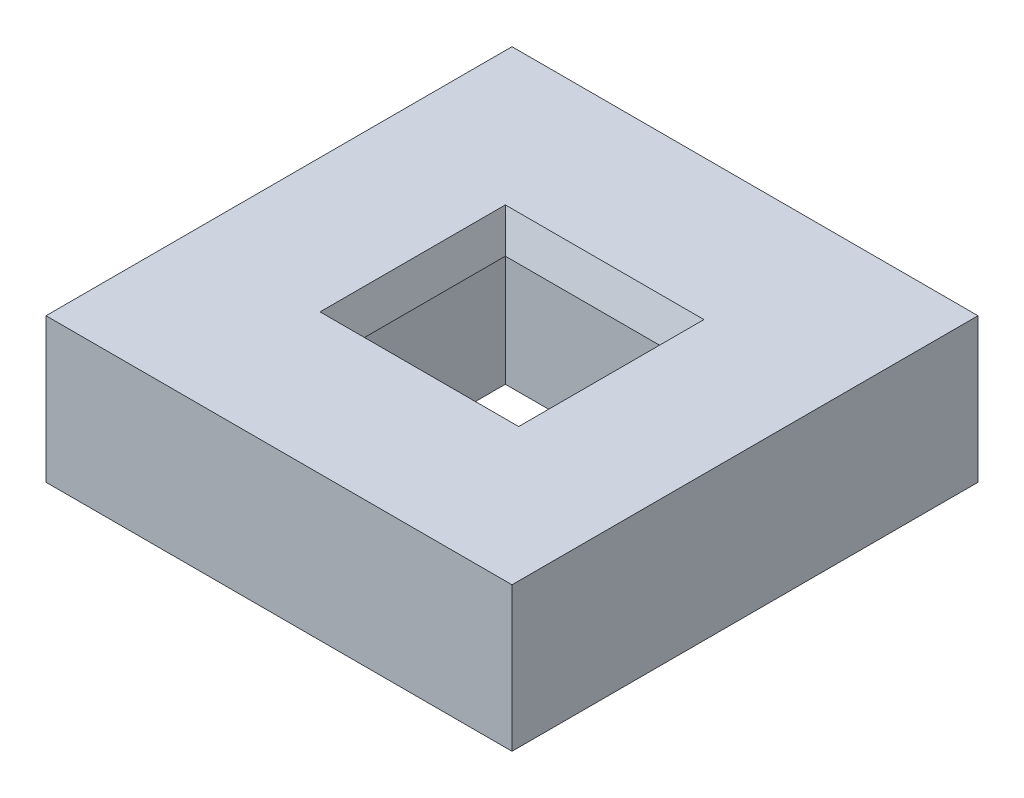
ISO-10303-21;
HEADER;
FILE_DESCRIPTION(('STEP AP214'),'2;1');
FILE_NAME('part.step','',(''),(''),'','','');
FILE_SCHEMA(('AUTOMOTIVE_DESIGN { 1 0 10303 214 1 1 1 1 }'));
ENDSEC;
DATA;
#1=APPLICATION_CONTEXT('core data for automotive mechanical design processes');
#2=APPLICATION_PROTOCOL_DEFINITION('international standard','automotive_design',2000,#1);
#3=PRODUCT_CONTEXT('',#1,'mechanical');
#4=PRODUCT('Part','Part','',(#3));
#5=PRODUCT_RELATED_PRODUCT_CATEGORY('part','',(#4));
#6=PRODUCT_DEFINITION_FORMATION('','',#4);
#7=PRODUCT_DEFINITION_CONTEXT('part definition',#1,'design');
#8=PRODUCT_DEFINITION('design','',#6,#7);
#9=PRODUCT_DEFINITION_SHAPE('','',#8);
#10=(LENGTH_UNIT() NAMED_UNIT(*) SI_UNIT(.MILLI.,.METRE.));
#11=(NAMED_UNIT(*) PLANE_ANGLE_UNIT() SI_UNIT($,.RADIAN.));
#12=(NAMED_UNIT(*) SI_UNIT($,.STERADIAN.) SOLID_ANGLE_UNIT());
#13=UNCERTAINTY_MEASURE_WITH_UNIT(LENGTH_MEASURE(1.E-05),#10,'distance_accuracy_value','');
#14=(GEOMETRIC_REPRESENTATION_CONTEXT(3) GLOBAL_UNCERTAINTY_ASSIGNED_CONTEXT((#13)) GLOBAL_UNIT_ASSIGNED_CONTEXT((#10,
#11,#12)) REPRESENTATION_CONTEXT('',''));
#15=CARTESIAN_POINT('',(0.,0.,0.));
#16=DIRECTION('',(0.,0.,1.));
#17=DIRECTION('',(1.,0.,0.));
#18=AXIS2_PLACEMENT_3D('',#15,#16,#17);
#19=CARTESIAN_POINT('',(0.,6.5,0.));
#20=DIRECTION('',(0.,1.,0.));
#21=DIRECTION('',(0.,0.,1.));
#22=AXIS2_PLACEMENT_3D('',#19,#20,#21);
#23=PLANE('',#22);
#24=DIRECTION('',(1.,0.,0.));
#25=VECTOR('',#24,1.);
#26=CARTESIAN_POINT('',(0.,6.5,-4.175));
#27=LINE('',#26,#25);
#28=CARTESIAN_POINT('',(-4.475,6.5,-4.175));
#29=VERTEX_POINT('',#28);
#30=CARTESIAN_POINT('',(4.475,6.5,-4.175));
#31=VERTEX_POINT('',#30);
#32=EDGE_CURVE('E177',#29,#31,#27,.T.);
#33=ORIENTED_EDGE('',*,*,#32,.T.);
#34=DIRECTION('',(0.,0.,1.));
#35=VECTOR('',#34,1.);
#36=CARTESIAN_POINT('',(4.475,6.5,0.));
#37=LINE('',#36,#35);
#38=CARTESIAN_POINT('',(4.475,6.5,4.175));
#39=VERTEX_POINT('',#38);
#40=EDGE_CURVE('E183',#31,#39,#37,.T.);
#41=ORIENTED_EDGE('',*,*,#40,.T.);
#42=DIRECTION('',(-1.,0.,0.));
#43=VECTOR('',#42,1.);
#44=CARTESIAN_POINT('',(0.,6.5,4.175));
#45=LINE('',#44,#43);
#46=CARTESIAN_POINT('',(-4.475,6.5,4.175));
#47=VERTEX_POINT('',#46);
#48=EDGE_CURVE('E181',#39,#47,#45,.T.);
#49=ORIENTED_EDGE('',*,*,#48,.T.);
#50=DIRECTION('',(0.,0.,-1.));
#51=VECTOR('',#50,1.);
#52=CARTESIAN_POINT('',(-4.475,6.5,0.));
#53=LINE('',#52,#51);
#54=EDGE_CURVE('E179',#47,#29,#53,.T.);
#55=ORIENTED_EDGE('',*,*,#54,.T.);
#56=EDGE_LOOP('',(#33,#41,#49,#55));
#57=FACE_BOUND('',#56,.T.);
#58=DIRECTION('',(0.,0.,1.));
#59=VECTOR('',#58,1.);
#60=CARTESIAN_POINT('',(-10.5,6.5,-10.5));
#61=LINE('',#60,#59);
#62=CARTESIAN_POINT('',(-10.5,6.5,-10.5));
#63=VERTEX_POINT('',#62);
#64=CARTESIAN_POINT('',(-10.5,6.5,10.5));
#65=VERTEX_POINT('',#64);
#66=EDGE_CURVE('E145',#63,#65,#61,.T.);
#67=ORIENTED_EDGE('',*,*,#66,.T.);
#68=DIRECTION('',(1.,0.,0.));
#69=VECTOR('',#68,1.);
#70=CARTESIAN_POINT('',(-10.5,6.5,10.5));
#71=LINE('',#70,#69);
#72=CARTESIAN_POINT('',(10.5,6.5,10.5));
#73=VERTEX_POINT('',#72);
#74=EDGE_CURVE('E148',#65,#73,#71,.T.);
#75=ORIENTED_EDGE('',*,*,#74,.T.);
#76=DIRECTION('',(0.,0.,-1.));
#77=VECTOR('',#76,1.);
#78=CARTESIAN_POINT('',(10.5,6.5,-10.5));
#79=LINE('',#78,#77);
#80=CARTESIAN_POINT('',(10.5,6.5,-10.5));
#81=VERTEX_POINT('',#80);
#82=EDGE_CURVE('E151',#73,#81,#79,.T.);
#83=ORIENTED_EDGE('',*,*,#82,.T.);
#84=DIRECTION('',(-1.,0.,0.));
#85=VECTOR('',#84,1.);
#86=CARTESIAN_POINT('',(-10.5,6.5,-10.5));
#87=LINE('',#86,#85);
#88=EDGE_CURVE('E153',#81,#63,#87,.T.);
#89=ORIENTED_EDGE('',*,*,#88,.T.);
#90=EDGE_LOOP('',(#67,#75,#83,#89));
#91=FACE_BOUND('',#90,.T.);
#92=ADVANCED_FACE('F35',(#57,#91),#23,.T.);
#93=CARTESIAN_POINT('',(0.,0.,0.));
#94=DIRECTION('',(0.,1.,0.));
#95=DIRECTION('',(0.,0.,1.));
#96=AXIS2_PLACEMENT_3D('',#93,#94,#95);
#97=PLANE('',#96);
#98=DIRECTION('',(0.,0.,1.));
#99=VECTOR('',#98,1.);
#100=CARTESIAN_POINT('',(-10.5,0.,-10.5));
#101=LINE('',#100,#99);
#102=CARTESIAN_POINT('',(-10.5,0.,-10.5));
#103=VERTEX_POINT('',#102);
#104=CARTESIAN_POINT('',(-10.5,0.,10.5));
#105=VERTEX_POINT('',#104);
#106=EDGE_CURVE('E119',#103,#105,#101,.T.);
#107=ORIENTED_EDGE('',*,*,#106,.F.);
#108=DIRECTION('',(-1.,0.,0.));
#109=VECTOR('',#108,1.);
#110=CARTESIAN_POINT('',(-10.5,0.,-10.5));
#111=LINE('',#110,#109);
#112=CARTESIAN_POINT('',(10.5,0.,-10.5));
#113=VERTEX_POINT('',#112);
#114=EDGE_CURVE('E149',#113,#103,#111,.T.);
#115=ORIENTED_EDGE('',*,*,#114,.F.);
#116=DIRECTION('',(0.,0.,-1.));
#117=VECTOR('',#116,1.);
#118=CARTESIAN_POINT('',(10.5,0.,-10.5));
#119=LINE('',#118,#117);
#120=CARTESIAN_POINT('',(10.5,0.,10.5));
#121=VERTEX_POINT('',#120);
#122=EDGE_CURVE('E160',#121,#113,#119,.T.);
#123=ORIENTED_EDGE('',*,*,#122,.F.);
#124=DIRECTION('',(1.,0.,0.));
#125=VECTOR('',#124,1.);
#126=CARTESIAN_POINT('',(-10.5,0.,10.5));
#127=LINE('',#126,#125);
#128=EDGE_CURVE('E158',#105,#121,#127,.T.);
#129=ORIENTED_EDGE('',*,*,#128,.F.);
#130=EDGE_LOOP('',(#107,#115,#123,#129));
#131=FACE_BOUND('',#130,.T.);
#132=DIRECTION('',(0.,0.,1.));
#133=VECTOR('',#132,1.);
#134=CARTESIAN_POINT('',(-3.975,0.,-3.675));
#135=LINE('',#134,#133);
#136=CARTESIAN_POINT('',(-3.975,0.,-3.675));
#137=VERTEX_POINT('',#136);
#138=CARTESIAN_POINT('',(-3.975,0.,3.675));
#139=VERTEX_POINT('',#138);
#140=EDGE_CURVE('E115',#137,#139,#135,.T.);
#141=ORIENTED_EDGE('',*,*,#140,.T.);
#142=DIRECTION('',(1.,0.,0.));
#143=VECTOR('',#142,1.);
#144=CARTESIAN_POINT('',(-3.975,0.,3.675));
#145=LINE('',#144,#143);
#146=CARTESIAN_POINT('',(3.975,0.,3.675));
#147=VERTEX_POINT('',#146);
#148=EDGE_CURVE('E123',#139,#147,#145,.T.);
#149=ORIENTED_EDGE('',*,*,#148,.T.);
#150=DIRECTION('',(0.,0.,-1.));
#151=VECTOR('',#150,1.);
#152=CARTESIAN_POINT('',(3.975,0.,-3.675));
#153=LINE('',#152,#151);
#154=CARTESIAN_POINT('',(3.975,0.,-3.675));
#155=VERTEX_POINT('',#154);
#156=EDGE_CURVE('E129',#147,#155,#153,.T.);
#157=ORIENTED_EDGE('',*,*,#156,.T.);
#158=DIRECTION('',(-1.,0.,0.));
#159=VECTOR('',#158,1.);
#160=CARTESIAN_POINT('',(-3.975,0.,-3.675));
#161=LINE('',#160,#159);
#162=EDGE_CURVE('E133',#155,#137,#161,.T.);
#163=ORIENTED_EDGE('',*,*,#162,.T.);
#164=EDGE_LOOP('',(#141,#149,#157,#163));
#165=FACE_BOUND('',#164,.T.);
#166=ADVANCED_FACE('F131',(#131,#165),#97,.F.);
#167=CARTESIAN_POINT('',(-10.5,6.5,-10.5));
#168=DIRECTION('',(1.,0.,0.));
#169=DIRECTION('',(0.,0.,-1.));
#170=AXIS2_PLACEMENT_3D('',#167,#168,#169);
#171=PLANE('',#170);
#172=ORIENTED_EDGE('',*,*,#106,.T.);
#173=DIRECTION('',(0.,-1.,0.));
#174=VECTOR('',#173,1.);
#175=CARTESIAN_POINT('',(-10.5,6.5,10.5));
#176=LINE('',#175,#174);
#177=EDGE_CURVE('E171',#65,#105,#176,.T.);
#178=ORIENTED_EDGE('',*,*,#177,.F.);
#179=ORIENTED_EDGE('',*,*,#66,.F.);
#180=DIRECTION('',(0.,-1.,0.));
#181=VECTOR('',#180,1.);
#182=CARTESIAN_POINT('',(-10.5,6.5,-10.5));
#183=LINE('',#182,#181);
#184=EDGE_CURVE('E155',#63,#103,#183,.T.);
#185=ORIENTED_EDGE('',*,*,#184,.T.);
#186=EDGE_LOOP('',(#172,#178,#179,#185));
#187=FACE_BOUND('',#186,.T.);
#188=ADVANCED_FACE('F222',(#187),#171,.F.);
#189=CARTESIAN_POINT('',(-10.5,6.5,10.5));
#190=DIRECTION('',(0.,0.,-1.));
#191=DIRECTION('',(-1.,0.,0.));
#192=AXIS2_PLACEMENT_3D('',#189,#190,#191);
#193=PLANE('',#192);
#194=ORIENTED_EDGE('',*,*,#128,.T.);
#195=DIRECTION('',(0.,-1.,0.));
#196=VECTOR('',#195,1.);
#197=CARTESIAN_POINT('',(10.5,6.5,10.5));
#198=LINE('',#197,#196);
#199=EDGE_CURVE('E168',#73,#121,#198,.T.);
#200=ORIENTED_EDGE('',*,*,#199,.F.);
#201=ORIENTED_EDGE('',*,*,#74,.F.);
#202=ORIENTED_EDGE('',*,*,#177,.T.);
#203=EDGE_LOOP('',(#194,#200,#201,#202));
#204=FACE_BOUND('',#203,.T.);
#205=ADVANCED_FACE('F236',(#204),#193,.F.);
#206=CARTESIAN_POINT('',(10.5,6.5,-10.5));
#207=DIRECTION('',(-1.,0.,0.));
#208=DIRECTION('',(0.,0.,1.));
#209=AXIS2_PLACEMENT_3D('',#206,#207,#208);
#210=PLANE('',#209);
#211=ORIENTED_EDGE('',*,*,#122,.T.);
#212=DIRECTION('',(0.,-1.,0.));
#213=VECTOR('',#212,1.);
#214=CARTESIAN_POINT('',(10.5,6.5,-10.5));
#215=LINE('',#214,#213);
#216=EDGE_CURVE('E165',#81,#113,#215,.T.);
#217=ORIENTED_EDGE('',*,*,#216,.F.);
#218=ORIENTED_EDGE('',*,*,#82,.F.);
#219=ORIENTED_EDGE('',*,*,#199,.T.);
#220=EDGE_LOOP('',(#211,#217,#218,#219));
#221=FACE_BOUND('',#220,.T.);
#222=ADVANCED_FACE('F232',(#221),#210,.F.);
#223=CARTESIAN_POINT('',(-10.5,6.5,-10.5));
#224=DIRECTION('',(0.,0.,1.));
#225=DIRECTION('',(1.,0.,0.));
#226=AXIS2_PLACEMENT_3D('',#223,#224,#225);
#227=PLANE('',#226);
#228=ORIENTED_EDGE('',*,*,#114,.T.);
#229=ORIENTED_EDGE('',*,*,#184,.F.);
#230=ORIENTED_EDGE('',*,*,#88,.F.);
#231=ORIENTED_EDGE('',*,*,#216,.T.);
#232=EDGE_LOOP('',(#228,#229,#230,#231));
#233=FACE_BOUND('',#232,.T.);
#234=ADVANCED_FACE('F229',(#233),#227,.F.);
#235=CARTESIAN_POINT('',(-3.975,6.5,-3.675));
#236=DIRECTION('',(1.,0.,0.));
#237=DIRECTION('',(0.,0.,-1.));
#238=AXIS2_PLACEMENT_3D('',#235,#236,#237);
#239=PLANE('',#238);
#240=DIRECTION('',(0.,-1.,0.));
#241=VECTOR('',#240,1.);
#242=CARTESIAN_POINT('',(-3.975,6.5,-3.675));
#243=LINE('',#242,#241);
#244=CARTESIAN_POINT('',(-3.975,4.99999999999998,-3.675));
#245=VERTEX_POINT('',#244);
#246=EDGE_CURVE('E140',#245,#137,#243,.T.);
#247=ORIENTED_EDGE('',*,*,#246,.F.);
#248=DIRECTION('',(0.,0.,1.));
#249=VECTOR('',#248,1.);
#250=CARTESIAN_POINT('',(-3.975,4.99999999999998,-3.675));
#251=LINE('',#250,#249);
#252=CARTESIAN_POINT('',(-3.975,4.99999999999998,3.675));
#253=VERTEX_POINT('',#252);
#254=EDGE_CURVE('E45',#245,#253,#251,.T.);
#255=ORIENTED_EDGE('',*,*,#254,.T.);
#256=DIRECTION('',(0.,-1.,0.));
#257=VECTOR('',#256,1.);
#258=CARTESIAN_POINT('',(-3.975,6.5,3.675));
#259=LINE('',#258,#257);
#260=EDGE_CURVE('E111',#253,#139,#259,.T.);
#261=ORIENTED_EDGE('',*,*,#260,.T.);
#262=ORIENTED_EDGE('',*,*,#140,.F.);
#263=EDGE_LOOP('',(#247,#255,#261,#262));
#264=FACE_BOUND('',#263,.T.);
#265=ADVANCED_FACE('F113',(#264),#239,.T.);
#266=CARTESIAN_POINT('',(-3.975,6.5,3.675));
#267=DIRECTION('',(0.,0.,-1.));
#268=DIRECTION('',(-1.,0.,0.));
#269=AXIS2_PLACEMENT_3D('',#266,#267,#268);
#270=PLANE('',#269);
#271=ORIENTED_EDGE('',*,*,#260,.F.);
#272=DIRECTION('',(1.,0.,0.));
#273=VECTOR('',#272,1.);
#274=CARTESIAN_POINT('',(-3.975,4.99999999999998,3.675));
#275=LINE('',#274,#273);
#276=CARTESIAN_POINT('',(3.975,4.99999999999998,3.675));
#277=VERTEX_POINT('',#276);
#278=EDGE_CURVE('E186',#253,#277,#275,.T.);
#279=ORIENTED_EDGE('',*,*,#278,.T.);
#280=DIRECTION('',(0.,-1.,0.));
#281=VECTOR('',#280,1.);
#282=CARTESIAN_POINT('',(3.975,6.5,3.675));
#283=LINE('',#282,#281);
#284=EDGE_CURVE('E120',#277,#147,#283,.T.);
#285=ORIENTED_EDGE('',*,*,#284,.T.);
#286=ORIENTED_EDGE('',*,*,#148,.F.);
#287=EDGE_LOOP('',(#271,#279,#285,#286));
#288=FACE_BOUND('',#287,.T.);
#289=ADVANCED_FACE('F124',(#288),#270,.T.);
#290=CARTESIAN_POINT('',(3.975,6.5,-3.675));
#291=DIRECTION('',(-1.,0.,0.));
#292=DIRECTION('',(0.,0.,1.));
#293=AXIS2_PLACEMENT_3D('',#290,#291,#292);
#294=PLANE('',#293);
#295=ORIENTED_EDGE('',*,*,#284,.F.);
#296=DIRECTION('',(0.,0.,-1.));
#297=VECTOR('',#296,1.);
#298=CARTESIAN_POINT('',(3.975,4.99999999999998,-3.675));
#299=LINE('',#298,#297);
#300=CARTESIAN_POINT('',(3.975,4.99999999999998,-3.675));
#301=VERTEX_POINT('',#300);
#302=EDGE_CURVE('E174',#277,#301,#299,.T.);
#303=ORIENTED_EDGE('',*,*,#302,.T.);
#304=DIRECTION('',(0.,-1.,0.));
#305=VECTOR('',#304,1.);
#306=CARTESIAN_POINT('',(3.975,6.5,-3.675));
#307=LINE('',#306,#305);
#308=EDGE_CURVE('E142',#301,#155,#307,.T.);
#309=ORIENTED_EDGE('',*,*,#308,.T.);
#310=ORIENTED_EDGE('',*,*,#156,.F.);
#311=EDGE_LOOP('',(#295,#303,#309,#310));
#312=FACE_BOUND('',#311,.T.);
#313=ADVANCED_FACE('F207',(#312),#294,.T.);
#314=CARTESIAN_POINT('',(-3.975,6.5,-3.675));
#315=DIRECTION('',(0.,0.,1.));
#316=DIRECTION('',(1.,0.,0.));
#317=AXIS2_PLACEMENT_3D('',#314,#315,#316);
#318=PLANE('',#317);
#319=ORIENTED_EDGE('',*,*,#308,.F.);
#320=DIRECTION('',(-1.,0.,0.));
#321=VECTOR('',#320,1.);
#322=CARTESIAN_POINT('',(-3.975,4.99999999999998,-3.675));
#323=LINE('',#322,#321);
#324=EDGE_CURVE('E11',#301,#245,#323,.T.);
#325=ORIENTED_EDGE('',*,*,#324,.T.);
#326=ORIENTED_EDGE('',*,*,#246,.T.);
#327=ORIENTED_EDGE('',*,*,#162,.F.);
#328=EDGE_LOOP('',(#319,#325,#326,#327));
#329=FACE_BOUND('',#328,.T.);
#330=ADVANCED_FACE('F208',(#329),#318,.T.);
#331=CARTESIAN_POINT('',(-3.975,4.99999999999998,-3.675));
#332=DIRECTION('',(-0.948683298050515,-0.316227766016834,0.));
#333=DIRECTION('',(0.,0.,1.));
#334=AXIS2_PLACEMENT_3D('',#331,#332,#333);
#335=PLANE('',#334);
#336=DIRECTION('',(0.30151134457776,-0.904534033733293,0.301511344577761));
#337=VECTOR('',#336,1.);
#338=CARTESIAN_POINT('',(-3.975,4.99999999999998,-3.675));
#339=LINE('',#338,#337);
#340=EDGE_CURVE('E136',#29,#245,#339,.T.);
#341=ORIENTED_EDGE('',*,*,#340,.F.);
#342=ORIENTED_EDGE('',*,*,#54,.F.);
#343=DIRECTION('',(0.30151134457776,-0.904534033733293,-0.301511344577761));
#344=VECTOR('',#343,1.);
#345=CARTESIAN_POINT('',(-3.975,4.99999999999998,3.675));
#346=LINE('',#345,#344);
#347=EDGE_CURVE('E40',#253,#47,#346,.F.);
#348=ORIENTED_EDGE('',*,*,#347,.F.);
#349=ORIENTED_EDGE('',*,*,#254,.F.);
#350=EDGE_LOOP('',(#341,#342,#348,#349));
#351=FACE_BOUND('',#350,.T.);
#352=ADVANCED_FACE('F38',(#351),#335,.F.);
#353=CARTESIAN_POINT('',(-3.975,4.99999999999998,3.675));
#354=DIRECTION('',(0.,-0.316227766016835,0.948683298050515));
#355=DIRECTION('',(1.,0.,0.));
#356=AXIS2_PLACEMENT_3D('',#353,#354,#355);
#357=PLANE('',#356);
#358=ORIENTED_EDGE('',*,*,#347,.T.);
#359=ORIENTED_EDGE('',*,*,#48,.F.);
#360=DIRECTION('',(-0.301511344577761,-0.904534033733293,-0.301511344577761));
#361=VECTOR('',#360,1.);
#362=CARTESIAN_POINT('',(3.30681818181819,2.99545454545454,3.00681818181819));
#363=LINE('',#362,#361);
#364=EDGE_CURVE('E191',#277,#39,#363,.F.);
#365=ORIENTED_EDGE('',*,*,#364,.F.);
#366=ORIENTED_EDGE('',*,*,#278,.F.);
#367=EDGE_LOOP('',(#358,#359,#365,#366));
#368=FACE_BOUND('',#367,.T.);
#369=ADVANCED_FACE('F204',(#368),#357,.F.);
#370=CARTESIAN_POINT('',(-3.975,4.99999999999998,-3.675));
#371=DIRECTION('',(0.,-0.316227766016835,-0.948683298050515));
#372=DIRECTION('',(-1.,0.,0.));
#373=AXIS2_PLACEMENT_3D('',#370,#371,#372);
#374=PLANE('',#373);
#375=ORIENTED_EDGE('',*,*,#340,.T.);
#376=ORIENTED_EDGE('',*,*,#324,.F.);
#377=DIRECTION('',(0.301511344577761,0.904534033733293,-0.301511344577761));
#378=VECTOR('',#377,1.);
#379=CARTESIAN_POINT('',(3.975,4.99999999999998,-3.675));
#380=LINE('',#379,#378);
#381=EDGE_CURVE('E189',#31,#301,#380,.F.);
#382=ORIENTED_EDGE('',*,*,#381,.F.);
#383=ORIENTED_EDGE('',*,*,#32,.F.);
#384=EDGE_LOOP('',(#375,#376,#382,#383));
#385=FACE_BOUND('',#384,.T.);
#386=ADVANCED_FACE('F196',(#385),#374,.F.);
#387=CARTESIAN_POINT('',(3.975,4.99999999999998,-3.675));
#388=DIRECTION('',(0.948683298050515,-0.316227766016835,0.));
#389=DIRECTION('',(0.,0.,-1.));
#390=AXIS2_PLACEMENT_3D('',#387,#388,#389);
#391=PLANE('',#390);
#392=ORIENTED_EDGE('',*,*,#364,.T.);
#393=ORIENTED_EDGE('',*,*,#40,.F.);
#394=ORIENTED_EDGE('',*,*,#381,.T.);
#395=ORIENTED_EDGE('',*,*,#302,.F.);
#396=EDGE_LOOP('',(#392,#393,#394,#395));
#397=FACE_BOUND('',#396,.T.);
#398=ADVANCED_FACE('F245',(#397),#391,.F.);
#399=CLOSED_SHELL('',(#92,#166,#188,#205,#222,#234,#265,#289,#313,#330,#352,#369,#386,#398));
#400=MANIFOLD_SOLID_BREP('B2',#399);
#401=ADVANCED_BREP_SHAPE_REPRESENTATION('',(#18,#400),#14);
#402=SHAPE_DEFINITION_REPRESENTATION(#9,#401);
ENDSEC;
END-ISO-10303-21;
